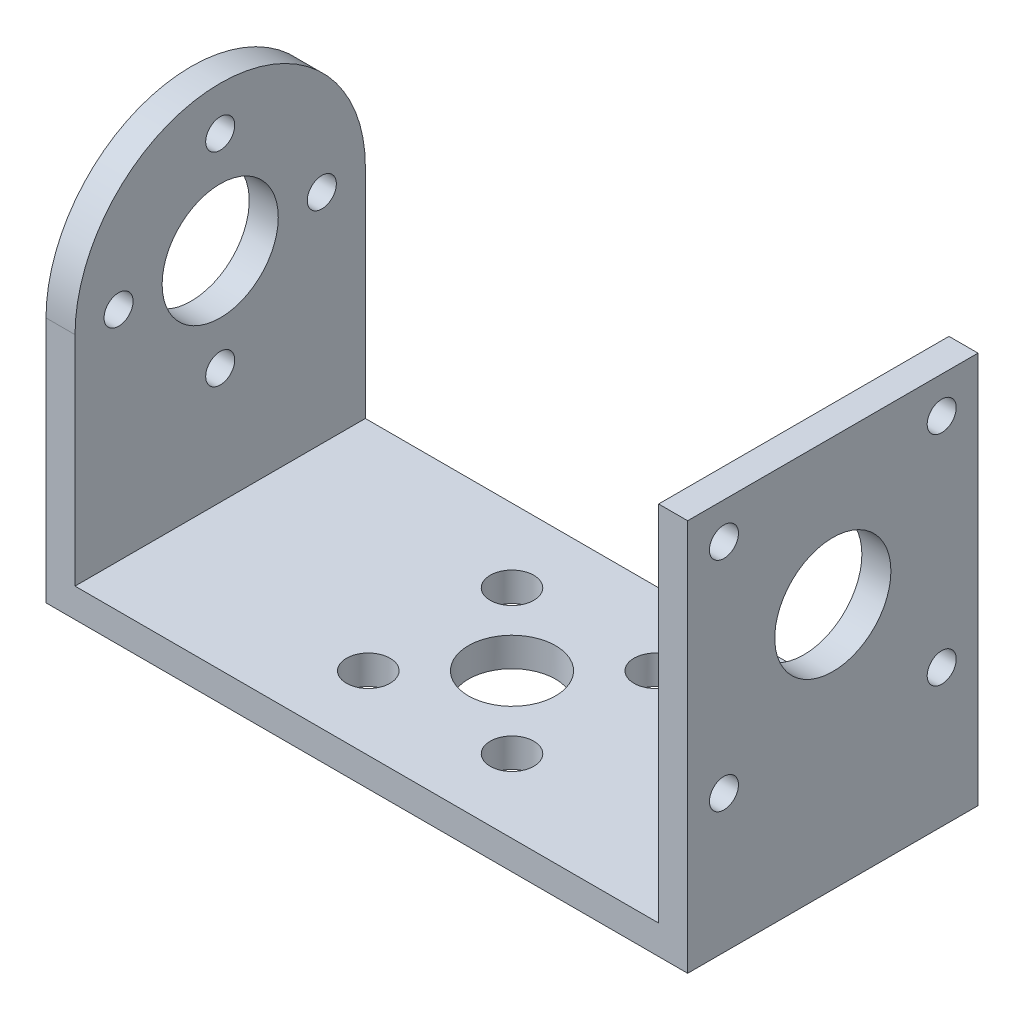
ISO-10303-21;
HEADER;
FILE_DESCRIPTION(('STEP AP214'),'2;1');
FILE_NAME('part.step','',(''),(''),'','','');
FILE_SCHEMA(('AUTOMOTIVE_DESIGN { 1 0 10303 214 1 1 1 1 }'));
ENDSEC;
DATA;
#1=APPLICATION_CONTEXT('core data for automotive mechanical design processes');
#2=APPLICATION_PROTOCOL_DEFINITION('international standard','automotive_design',2000,#1);
#3=PRODUCT_CONTEXT('',#1,'mechanical');
#4=PRODUCT('Part','Part','',(#3));
#5=PRODUCT_RELATED_PRODUCT_CATEGORY('part','',(#4));
#6=PRODUCT_DEFINITION_FORMATION('','',#4);
#7=PRODUCT_DEFINITION_CONTEXT('part definition',#1,'design');
#8=PRODUCT_DEFINITION('design','',#6,#7);
#9=PRODUCT_DEFINITION_SHAPE('','',#8);
#10=(LENGTH_UNIT() NAMED_UNIT(*) SI_UNIT(.MILLI.,.METRE.));
#11=(NAMED_UNIT(*) PLANE_ANGLE_UNIT() SI_UNIT($,.RADIAN.));
#12=(NAMED_UNIT(*) SI_UNIT($,.STERADIAN.) SOLID_ANGLE_UNIT());
#13=UNCERTAINTY_MEASURE_WITH_UNIT(LENGTH_MEASURE(1.E-05),#10,'distance_accuracy_value','');
#14=(GEOMETRIC_REPRESENTATION_CONTEXT(3) GLOBAL_UNCERTAINTY_ASSIGNED_CONTEXT((#13)) GLOBAL_UNIT_ASSIGNED_CONTEXT((#10,
#11,#12)) REPRESENTATION_CONTEXT('',''));
#15=CARTESIAN_POINT('',(0.,0.,0.));
#16=DIRECTION('',(0.,0.,1.));
#17=DIRECTION('',(1.,0.,0.));
#18=AXIS2_PLACEMENT_3D('',#15,#16,#17);
#19=CARTESIAN_POINT('',(-22.1,2.,10.));
#20=DIRECTION('',(1.,0.,0.));
#21=DIRECTION('',(0.,0.,-1.));
#22=AXIS2_PLACEMENT_3D('',#19,#20,#21);
#23=PLANE('',#22);
#24=CARTESIAN_POINT('',(-22.1,17.,0.));
#25=DIRECTION('',(-1.,0.,0.));
#26=DIRECTION('',(0.,0.,1.));
#27=AXIS2_PLACEMENT_3D('',#24,#25,#26);
#28=CIRCLE('',#27,4.);
#29=CARTESIAN_POINT('',(-22.1,17.,4.));
#30=VERTEX_POINT('',#29);
#31=EDGE_CURVE('E289',#30,#30,#28,.T.);
#32=ORIENTED_EDGE('',*,*,#31,.F.);
#33=EDGE_LOOP('',(#32));
#34=FACE_BOUND('',#33,.T.);
#35=CARTESIAN_POINT('',(-22.1,10.,3.46818829043387E-13));
#36=DIRECTION('',(-1.,0.,0.));
#37=DIRECTION('',(0.,0.,1.));
#38=AXIS2_PLACEMENT_3D('',#35,#36,#37);
#39=CIRCLE('',#38,1.);
#40=CARTESIAN_POINT('',(-22.1,10.,1.00000000000035));
#41=VERTEX_POINT('',#40);
#42=EDGE_CURVE('E188',#41,#41,#39,.T.);
#43=ORIENTED_EDGE('',*,*,#42,.F.);
#44=EDGE_LOOP('',(#43));
#45=FACE_BOUND('',#44,.T.);
#46=CARTESIAN_POINT('',(-22.1,16.9999999999999,-6.9999999999998));
#47=DIRECTION('',(-1.,0.,0.));
#48=DIRECTION('',(0.,0.,1.));
#49=AXIS2_PLACEMENT_3D('',#46,#47,#48);
#50=CIRCLE('',#49,0.999999999999999);
#51=CARTESIAN_POINT('',(-22.1,16.9999999999999,-5.9999999999998));
#52=VERTEX_POINT('',#51);
#53=EDGE_CURVE('E266',#52,#52,#50,.T.);
#54=ORIENTED_EDGE('',*,*,#53,.F.);
#55=EDGE_LOOP('',(#54));
#56=FACE_BOUND('',#55,.T.);
#57=CARTESIAN_POINT('',(-22.1,24.,0.));
#58=DIRECTION('',(-1.,0.,0.));
#59=DIRECTION('',(0.,0.,1.));
#60=AXIS2_PLACEMENT_3D('',#57,#58,#59);
#61=CIRCLE('',#60,1.);
#62=CARTESIAN_POINT('',(-22.1,24.,1.));
#63=VERTEX_POINT('',#62);
#64=EDGE_CURVE('E273',#63,#63,#61,.T.);
#65=ORIENTED_EDGE('',*,*,#64,.F.);
#66=EDGE_LOOP('',(#65));
#67=FACE_BOUND('',#66,.T.);
#68=CARTESIAN_POINT('',(-22.1,17.0000000000002,7.0000000000002));
#69=DIRECTION('',(-1.,0.,0.));
#70=DIRECTION('',(0.,0.,1.));
#71=AXIS2_PLACEMENT_3D('',#68,#69,#70);
#72=CIRCLE('',#71,1.);
#73=CARTESIAN_POINT('',(-22.1,17.0000000000002,8.0000000000002));
#74=VERTEX_POINT('',#73);
#75=EDGE_CURVE('E279',#74,#74,#72,.T.);
#76=ORIENTED_EDGE('',*,*,#75,.F.);
#77=EDGE_LOOP('',(#76));
#78=FACE_BOUND('',#77,.T.);
#79=CARTESIAN_POINT('',(-22.1,17.,0.));
#80=DIRECTION('',(-1.,0.,0.));
#81=DIRECTION('',(0.,0.,1.));
#82=AXIS2_PLACEMENT_3D('',#79,#80,#81);
#83=CIRCLE('',#82,10.);
#84=CARTESIAN_POINT('',(-22.1,17.,10.));
#85=VERTEX_POINT('',#84);
#86=CARTESIAN_POINT('',(-22.1,17.,-10.));
#87=VERTEX_POINT('',#86);
#88=EDGE_CURVE('E174',#85,#87,#83,.T.);
#89=ORIENTED_EDGE('',*,*,#88,.T.);
#90=DIRECTION('',(0.,-1.,0.));
#91=VECTOR('',#90,1.);
#92=CARTESIAN_POINT('',(-22.1,2.,-10.));
#93=LINE('',#92,#91);
#94=CARTESIAN_POINT('',(-22.1,0.,-10.));
#95=VERTEX_POINT('',#94);
#96=EDGE_CURVE('E117',#87,#95,#93,.T.);
#97=ORIENTED_EDGE('',*,*,#96,.T.);
#98=DIRECTION('',(0.,0.,1.));
#99=VECTOR('',#98,1.);
#100=CARTESIAN_POINT('',(-22.1,0.,10.));
#101=LINE('',#100,#99);
#102=CARTESIAN_POINT('',(-22.1,0.,10.));
#103=VERTEX_POINT('',#102);
#104=EDGE_CURVE('E201',#95,#103,#101,.T.);
#105=ORIENTED_EDGE('',*,*,#104,.T.);
#106=DIRECTION('',(0.,-1.,0.));
#107=VECTOR('',#106,1.);
#108=CARTESIAN_POINT('',(-22.1,2.,10.));
#109=LINE('',#108,#107);
#110=EDGE_CURVE('E179',#85,#103,#109,.T.);
#111=ORIENTED_EDGE('',*,*,#110,.F.);
#112=EDGE_LOOP('',(#89,#97,#105,#111));
#113=FACE_BOUND('',#112,.T.);
#114=ADVANCED_FACE('F109',(#34,#45,#56,#67,#78,#113),#23,.F.);
#115=CARTESIAN_POINT('',(-20.1,0.,0.));
#116=DIRECTION('',(1.,0.,0.));
#117=DIRECTION('',(0.,0.,-1.));
#118=AXIS2_PLACEMENT_3D('',#115,#116,#117);
#119=PLANE('',#118);
#120=CARTESIAN_POINT('',(-20.1,17.,0.));
#121=DIRECTION('',(1.,0.,0.));
#122=DIRECTION('',(0.,0.,-1.));
#123=AXIS2_PLACEMENT_3D('',#120,#121,#122);
#124=CIRCLE('',#123,4.);
#125=CARTESIAN_POINT('',(-20.1,17.,-4.));
#126=VERTEX_POINT('',#125);
#127=EDGE_CURVE('E292',#126,#126,#124,.F.);
#128=ORIENTED_EDGE('',*,*,#127,.T.);
#129=EDGE_LOOP('',(#128));
#130=FACE_BOUND('',#129,.T.);
#131=CARTESIAN_POINT('',(-20.1,10.,3.46818829043387E-13));
#132=DIRECTION('',(1.,0.,0.));
#133=DIRECTION('',(0.,0.,-1.));
#134=AXIS2_PLACEMENT_3D('',#131,#132,#133);
#135=CIRCLE('',#134,1.);
#136=CARTESIAN_POINT('',(-20.1,10.,-0.999999999999654));
#137=VERTEX_POINT('',#136);
#138=EDGE_CURVE('E286',#137,#137,#135,.F.);
#139=ORIENTED_EDGE('',*,*,#138,.T.);
#140=EDGE_LOOP('',(#139));
#141=FACE_BOUND('',#140,.T.);
#142=CARTESIAN_POINT('',(-20.1,17.0000000000002,7.0000000000002));
#143=DIRECTION('',(1.,0.,0.));
#144=DIRECTION('',(0.,0.,-1.));
#145=AXIS2_PLACEMENT_3D('',#142,#143,#144);
#146=CIRCLE('',#145,1.);
#147=CARTESIAN_POINT('',(-20.1,17.0000000000002,6.0000000000002));
#148=VERTEX_POINT('',#147);
#149=EDGE_CURVE('E187',#148,#148,#146,.F.);
#150=ORIENTED_EDGE('',*,*,#149,.T.);
#151=EDGE_LOOP('',(#150));
#152=FACE_BOUND('',#151,.T.);
#153=CARTESIAN_POINT('',(-20.1,24.,0.));
#154=DIRECTION('',(1.,0.,0.));
#155=DIRECTION('',(0.,0.,-1.));
#156=AXIS2_PLACEMENT_3D('',#153,#154,#155);
#157=CIRCLE('',#156,1.);
#158=CARTESIAN_POINT('',(-20.1,24.,-1.));
#159=VERTEX_POINT('',#158);
#160=EDGE_CURVE('E276',#159,#159,#157,.F.);
#161=ORIENTED_EDGE('',*,*,#160,.T.);
#162=EDGE_LOOP('',(#161));
#163=FACE_BOUND('',#162,.T.);
#164=CARTESIAN_POINT('',(-20.1,16.9999999999999,-6.9999999999998));
#165=DIRECTION('',(1.,0.,0.));
#166=DIRECTION('',(0.,0.,-1.));
#167=AXIS2_PLACEMENT_3D('',#164,#165,#166);
#168=CIRCLE('',#167,0.999999999999999);
#169=CARTESIAN_POINT('',(-20.1,16.9999999999999,-7.9999999999998));
#170=VERTEX_POINT('',#169);
#171=EDGE_CURVE('E270',#170,#170,#168,.F.);
#172=ORIENTED_EDGE('',*,*,#171,.T.);
#173=EDGE_LOOP('',(#172));
#174=FACE_BOUND('',#173,.T.);
#175=DIRECTION('',(0.,-1.,0.));
#176=VECTOR('',#175,1.);
#177=CARTESIAN_POINT('',(-20.1,2.,-10.));
#178=LINE('',#177,#176);
#179=CARTESIAN_POINT('',(-20.1,17.,-10.));
#180=VERTEX_POINT('',#179);
#181=CARTESIAN_POINT('',(-20.1,2.,-10.));
#182=VERTEX_POINT('',#181);
#183=EDGE_CURVE('E245',#180,#182,#178,.T.);
#184=ORIENTED_EDGE('',*,*,#183,.F.);
#185=CARTESIAN_POINT('',(-20.1,17.,0.));
#186=DIRECTION('',(1.,0.,0.));
#187=DIRECTION('',(0.,0.,-1.));
#188=AXIS2_PLACEMENT_3D('',#185,#186,#187);
#189=CIRCLE('',#188,10.);
#190=CARTESIAN_POINT('',(-20.1,17.,10.));
#191=VERTEX_POINT('',#190);
#192=EDGE_CURVE('E180',#191,#180,#189,.F.);
#193=ORIENTED_EDGE('',*,*,#192,.F.);
#194=DIRECTION('',(0.,1.,0.));
#195=VECTOR('',#194,1.);
#196=CARTESIAN_POINT('',(-20.1,2.,10.));
#197=LINE('',#196,#195);
#198=CARTESIAN_POINT('',(-20.1,2.,10.));
#199=VERTEX_POINT('',#198);
#200=EDGE_CURVE('E221',#199,#191,#197,.T.);
#201=ORIENTED_EDGE('',*,*,#200,.F.);
#202=DIRECTION('',(0.,0.,1.));
#203=VECTOR('',#202,1.);
#204=CARTESIAN_POINT('',(-20.1,2.,-10.));
#205=LINE('',#204,#203);
#206=EDGE_CURVE('E243',#182,#199,#205,.T.);
#207=ORIENTED_EDGE('',*,*,#206,.F.);
#208=EDGE_LOOP('',(#184,#193,#201,#207));
#209=FACE_BOUND('',#208,.T.);
#210=ADVANCED_FACE('F363',(#130,#141,#152,#163,#174,#209),#119,.T.);
#211=CARTESIAN_POINT('',(-22.1,2.,-10.));
#212=DIRECTION('',(0.,0.,1.));
#213=DIRECTION('',(1.,0.,0.));
#214=AXIS2_PLACEMENT_3D('',#211,#212,#213);
#215=PLANE('',#214);
#216=DIRECTION('',(-1.,0.,0.));
#217=VECTOR('',#216,1.);
#218=CARTESIAN_POINT('',(22.101,17.,-10.));
#219=LINE('',#218,#217);
#220=EDGE_CURVE('E183',#180,#87,#219,.T.);
#221=ORIENTED_EDGE('',*,*,#220,.F.);
#222=ORIENTED_EDGE('',*,*,#183,.T.);
#223=DIRECTION('',(-1.,0.,0.));
#224=VECTOR('',#223,1.);
#225=CARTESIAN_POINT('',(-22.1,2.,-10.));
#226=LINE('',#225,#224);
#227=CARTESIAN_POINT('',(20.1,2.,-10.));
#228=VERTEX_POINT('',#227);
#229=EDGE_CURVE('E200',#228,#182,#226,.T.);
#230=ORIENTED_EDGE('',*,*,#229,.F.);
#231=DIRECTION('',(0.,-1.,0.));
#232=VECTOR('',#231,1.);
#233=CARTESIAN_POINT('',(20.1,2.,-10.));
#234=LINE('',#233,#232);
#235=CARTESIAN_POINT('',(20.1,27.,-10.));
#236=VERTEX_POINT('',#235);
#237=EDGE_CURVE('E257',#236,#228,#234,.T.);
#238=ORIENTED_EDGE('',*,*,#237,.F.);
#239=DIRECTION('',(1.,0.,0.));
#240=VECTOR('',#239,1.);
#241=CARTESIAN_POINT('',(20.1,27.,-10.));
#242=LINE('',#241,#240);
#243=CARTESIAN_POINT('',(22.1,27.,-10.));
#244=VERTEX_POINT('',#243);
#245=EDGE_CURVE('E248',#236,#244,#242,.T.);
#246=ORIENTED_EDGE('',*,*,#245,.T.);
#247=DIRECTION('',(0.,-1.,0.));
#248=VECTOR('',#247,1.);
#249=CARTESIAN_POINT('',(22.1,2.,-10.));
#250=LINE('',#249,#248);
#251=CARTESIAN_POINT('',(22.1,0.,-10.));
#252=VERTEX_POINT('',#251);
#253=EDGE_CURVE('E12',#244,#252,#250,.T.);
#254=ORIENTED_EDGE('',*,*,#253,.T.);
#255=DIRECTION('',(-1.,0.,0.));
#256=VECTOR('',#255,1.);
#257=CARTESIAN_POINT('',(-22.1,0.,-10.));
#258=LINE('',#257,#256);
#259=EDGE_CURVE('E191',#252,#95,#258,.T.);
#260=ORIENTED_EDGE('',*,*,#259,.T.);
#261=ORIENTED_EDGE('',*,*,#96,.F.);
#262=EDGE_LOOP('',(#221,#222,#230,#238,#246,#254,#260,#261));
#263=FACE_BOUND('',#262,.T.);
#264=ADVANCED_FACE('F190',(#263),#215,.F.);
#265=CARTESIAN_POINT('',(22.1,2.,10.));
#266=DIRECTION('',(-1.,0.,0.));
#267=DIRECTION('',(0.,0.,1.));
#268=AXIS2_PLACEMENT_3D('',#265,#266,#267);
#269=PLANE('',#268);
#270=CARTESIAN_POINT('',(22.1,24.5,7.5));
#271=DIRECTION('',(1.,0.,0.));
#272=DIRECTION('',(0.,0.,-1.));
#273=AXIS2_PLACEMENT_3D('',#270,#271,#272);
#274=CIRCLE('',#273,1.);
#275=CARTESIAN_POINT('',(22.1,24.5,6.5));
#276=VERTEX_POINT('',#275);
#277=EDGE_CURVE('E299',#276,#276,#274,.T.);
#278=ORIENTED_EDGE('',*,*,#277,.F.);
#279=EDGE_LOOP('',(#278));
#280=FACE_BOUND('',#279,.T.);
#281=CARTESIAN_POINT('',(22.1,24.5,-7.5));
#282=DIRECTION('',(1.,0.,0.));
#283=DIRECTION('',(0.,0.,-1.));
#284=AXIS2_PLACEMENT_3D('',#281,#282,#283);
#285=CIRCLE('',#284,1.);
#286=CARTESIAN_POINT('',(22.1,24.5,-8.5));
#287=VERTEX_POINT('',#286);
#288=EDGE_CURVE('E315',#287,#287,#285,.T.);
#289=ORIENTED_EDGE('',*,*,#288,.F.);
#290=EDGE_LOOP('',(#289));
#291=FACE_BOUND('',#290,.T.);
#292=CARTESIAN_POINT('',(22.1,9.5,-7.50000000000016));
#293=DIRECTION('',(1.,0.,0.));
#294=DIRECTION('',(0.,0.,-1.));
#295=AXIS2_PLACEMENT_3D('',#292,#293,#294);
#296=CIRCLE('',#295,1.);
#297=CARTESIAN_POINT('',(22.1,9.5,-8.50000000000016));
#298=VERTEX_POINT('',#297);
#299=EDGE_CURVE('E311',#298,#298,#296,.T.);
#300=ORIENTED_EDGE('',*,*,#299,.F.);
#301=EDGE_LOOP('',(#300));
#302=FACE_BOUND('',#301,.T.);
#303=CARTESIAN_POINT('',(22.1,9.5,7.49999999999984));
#304=DIRECTION('',(1.,0.,0.));
#305=DIRECTION('',(0.,0.,-1.));
#306=AXIS2_PLACEMENT_3D('',#303,#304,#305);
#307=CIRCLE('',#306,1.);
#308=CARTESIAN_POINT('',(22.1,9.5,6.49999999999984));
#309=VERTEX_POINT('',#308);
#310=EDGE_CURVE('E305',#309,#309,#307,.T.);
#311=ORIENTED_EDGE('',*,*,#310,.F.);
#312=EDGE_LOOP('',(#311));
#313=FACE_BOUND('',#312,.T.);
#314=CARTESIAN_POINT('',(22.1,17.,0.));
#315=DIRECTION('',(1.,0.,0.));
#316=DIRECTION('',(0.,0.,-1.));
#317=AXIS2_PLACEMENT_3D('',#314,#315,#316);
#318=CIRCLE('',#317,4.);
#319=CARTESIAN_POINT('',(22.1,17.,-4.));
#320=VERTEX_POINT('',#319);
#321=EDGE_CURVE('E295',#320,#320,#318,.T.);
#322=ORIENTED_EDGE('',*,*,#321,.F.);
#323=EDGE_LOOP('',(#322));
#324=FACE_BOUND('',#323,.T.);
#325=DIRECTION('',(0.,0.,-1.));
#326=VECTOR('',#325,1.);
#327=CARTESIAN_POINT('',(22.1,0.,10.));
#328=LINE('',#327,#326);
#329=CARTESIAN_POINT('',(22.1,0.,10.));
#330=VERTEX_POINT('',#329);
#331=EDGE_CURVE('E204',#330,#252,#328,.T.);
#332=ORIENTED_EDGE('',*,*,#331,.T.);
#333=ORIENTED_EDGE('',*,*,#253,.F.);
#334=DIRECTION('',(0.,0.,-1.));
#335=VECTOR('',#334,1.);
#336=CARTESIAN_POINT('',(22.1,27.,-10.));
#337=LINE('',#336,#335);
#338=CARTESIAN_POINT('',(22.1,27.,10.));
#339=VERTEX_POINT('',#338);
#340=EDGE_CURVE('E254',#339,#244,#337,.T.);
#341=ORIENTED_EDGE('',*,*,#340,.F.);
#342=DIRECTION('',(0.,-1.,0.));
#343=VECTOR('',#342,1.);
#344=CARTESIAN_POINT('',(22.1,2.,10.));
#345=LINE('',#344,#343);
#346=EDGE_CURVE('E193',#339,#330,#345,.T.);
#347=ORIENTED_EDGE('',*,*,#346,.T.);
#348=EDGE_LOOP('',(#332,#333,#341,#347));
#349=FACE_BOUND('',#348,.T.);
#350=ADVANCED_FACE('F111',(#280,#291,#302,#313,#324,#349),#269,.F.);
#351=CARTESIAN_POINT('',(-22.1,2.,10.));
#352=DIRECTION('',(0.,0.,-1.));
#353=DIRECTION('',(-1.,0.,0.));
#354=AXIS2_PLACEMENT_3D('',#351,#352,#353);
#355=PLANE('',#354);
#356=ORIENTED_EDGE('',*,*,#200,.T.);
#357=DIRECTION('',(-1.,0.,0.));
#358=VECTOR('',#357,1.);
#359=CARTESIAN_POINT('',(22.101,17.,10.));
#360=LINE('',#359,#358);
#361=EDGE_CURVE('E124',#191,#85,#360,.T.);
#362=ORIENTED_EDGE('',*,*,#361,.T.);
#363=ORIENTED_EDGE('',*,*,#110,.T.);
#364=DIRECTION('',(1.,0.,0.));
#365=VECTOR('',#364,1.);
#366=CARTESIAN_POINT('',(-22.1,0.,10.));
#367=LINE('',#366,#365);
#368=EDGE_CURVE('E198',#103,#330,#367,.T.);
#369=ORIENTED_EDGE('',*,*,#368,.T.);
#370=ORIENTED_EDGE('',*,*,#346,.F.);
#371=DIRECTION('',(1.,0.,0.));
#372=VECTOR('',#371,1.);
#373=CARTESIAN_POINT('',(20.1,27.,10.));
#374=LINE('',#373,#372);
#375=CARTESIAN_POINT('',(20.1,27.,10.));
#376=VERTEX_POINT('',#375);
#377=EDGE_CURVE('E247',#376,#339,#374,.T.);
#378=ORIENTED_EDGE('',*,*,#377,.F.);
#379=DIRECTION('',(0.,1.,0.));
#380=VECTOR('',#379,1.);
#381=CARTESIAN_POINT('',(20.1,2.,10.));
#382=LINE('',#381,#380);
#383=CARTESIAN_POINT('',(20.1,2.,10.));
#384=VERTEX_POINT('',#383);
#385=EDGE_CURVE('E259',#384,#376,#382,.T.);
#386=ORIENTED_EDGE('',*,*,#385,.F.);
#387=DIRECTION('',(1.,0.,0.));
#388=VECTOR('',#387,1.);
#389=CARTESIAN_POINT('',(-22.1,2.,10.));
#390=LINE('',#389,#388);
#391=EDGE_CURVE('E132',#199,#384,#390,.T.);
#392=ORIENTED_EDGE('',*,*,#391,.F.);
#393=EDGE_LOOP('',(#356,#362,#363,#369,#370,#378,#386,#392));
#394=FACE_BOUND('',#393,.T.);
#395=ADVANCED_FACE('F338',(#394),#355,.F.);
#396=CARTESIAN_POINT('',(0.,2.,0.));
#397=DIRECTION('',(0.,-1.,0.));
#398=DIRECTION('',(0.,0.,-1.));
#399=AXIS2_PLACEMENT_3D('',#396,#397,#398);
#400=PLANE('',#399);
#401=CARTESIAN_POINT('',(4.94974746830581,2.,4.94974746830581));
#402=DIRECTION('',(0.,1.,0.));
#403=DIRECTION('',(0.,0.,1.));
#404=AXIS2_PLACEMENT_3D('',#401,#402,#403);
#405=CIRCLE('',#404,1.5000000000001);
#406=CARTESIAN_POINT('',(4.94974746830581,2.,6.44974746830591));
#407=VERTEX_POINT('',#406);
#408=EDGE_CURVE('E214',#407,#407,#405,.T.);
#409=ORIENTED_EDGE('',*,*,#408,.F.);
#410=EDGE_LOOP('',(#409));
#411=FACE_BOUND('',#410,.T.);
#412=CARTESIAN_POINT('',(-4.94974746830586,2.,4.94974746830581));
#413=DIRECTION('',(0.,1.,0.));
#414=DIRECTION('',(0.,0.,1.));
#415=AXIS2_PLACEMENT_3D('',#412,#413,#414);
#416=CIRCLE('',#415,1.50000000000009);
#417=CARTESIAN_POINT('',(-4.94974746830586,2.,6.4497474683059));
#418=VERTEX_POINT('',#417);
#419=EDGE_CURVE('E233',#418,#418,#416,.T.);
#420=ORIENTED_EDGE('',*,*,#419,.F.);
#421=EDGE_LOOP('',(#420));
#422=FACE_BOUND('',#421,.T.);
#423=CARTESIAN_POINT('',(-4.94974746830586,2.,-4.94974746830585));
#424=DIRECTION('',(0.,1.,0.));
#425=DIRECTION('',(0.,0.,1.));
#426=AXIS2_PLACEMENT_3D('',#423,#424,#425);
#427=CIRCLE('',#426,1.50000000000002);
#428=CARTESIAN_POINT('',(-4.94974746830586,2.,-3.44974746830583));
#429=VERTEX_POINT('',#428);
#430=EDGE_CURVE('E227',#429,#429,#427,.T.);
#431=ORIENTED_EDGE('',*,*,#430,.F.);
#432=EDGE_LOOP('',(#431));
#433=FACE_BOUND('',#432,.T.);
#434=CARTESIAN_POINT('',(4.94974746830583,2.,-4.94974746830585));
#435=DIRECTION('',(0.,1.,0.));
#436=DIRECTION('',(0.,0.,1.));
#437=AXIS2_PLACEMENT_3D('',#434,#435,#436);
#438=CIRCLE('',#437,1.5);
#439=CARTESIAN_POINT('',(4.94974746830583,2.,-3.44974746830585));
#440=VERTEX_POINT('',#439);
#441=EDGE_CURVE('E220',#440,#440,#438,.T.);
#442=ORIENTED_EDGE('',*,*,#441,.F.);
#443=EDGE_LOOP('',(#442));
#444=FACE_BOUND('',#443,.T.);
#445=CARTESIAN_POINT('',(0.,2.,0.));
#446=DIRECTION('',(0.,1.,0.));
#447=DIRECTION('',(0.,0.,1.));
#448=AXIS2_PLACEMENT_3D('',#445,#446,#447);
#449=CIRCLE('',#448,3.);
#450=CARTESIAN_POINT('',(0.,2.,3.));
#451=VERTEX_POINT('',#450);
#452=EDGE_CURVE('E207',#451,#451,#449,.T.);
#453=ORIENTED_EDGE('',*,*,#452,.F.);
#454=EDGE_LOOP('',(#453));
#455=FACE_BOUND('',#454,.T.);
#456=ORIENTED_EDGE('',*,*,#391,.T.);
#457=DIRECTION('',(0.,0.,1.));
#458=VECTOR('',#457,1.);
#459=CARTESIAN_POINT('',(20.1,2.,-10.));
#460=LINE('',#459,#458);
#461=EDGE_CURVE('E251',#228,#384,#460,.T.);
#462=ORIENTED_EDGE('',*,*,#461,.F.);
#463=ORIENTED_EDGE('',*,*,#229,.T.);
#464=ORIENTED_EDGE('',*,*,#206,.T.);
#465=EDGE_LOOP('',(#456,#462,#463,#464));
#466=FACE_BOUND('',#465,.T.);
#467=ADVANCED_FACE('F364',(#411,#422,#433,#444,#455,#466),#400,.F.);
#468=CARTESIAN_POINT('',(0.,0.,0.));
#469=DIRECTION('',(0.,-1.,0.));
#470=DIRECTION('',(0.,0.,-1.));
#471=AXIS2_PLACEMENT_3D('',#468,#469,#470);
#472=PLANE('',#471);
#473=CARTESIAN_POINT('',(4.94974746830581,0.,4.94974746830581));
#474=DIRECTION('',(0.,-1.,0.));
#475=DIRECTION('',(0.,0.,-1.));
#476=AXIS2_PLACEMENT_3D('',#473,#474,#475);
#477=CIRCLE('',#476,1.5000000000001);
#478=CARTESIAN_POINT('',(4.94974746830581,0.,3.44974746830571));
#479=VERTEX_POINT('',#478);
#480=EDGE_CURVE('E236',#479,#479,#477,.F.);
#481=ORIENTED_EDGE('',*,*,#480,.T.);
#482=EDGE_LOOP('',(#481));
#483=FACE_BOUND('',#482,.T.);
#484=CARTESIAN_POINT('',(-4.94974746830586,0.,4.94974746830581));
#485=DIRECTION('',(0.,-1.,0.));
#486=DIRECTION('',(0.,0.,-1.));
#487=AXIS2_PLACEMENT_3D('',#484,#485,#486);
#488=CIRCLE('',#487,1.50000000000009);
#489=CARTESIAN_POINT('',(-4.94974746830586,0.,3.44974746830573));
#490=VERTEX_POINT('',#489);
#491=EDGE_CURVE('E230',#490,#490,#488,.F.);
#492=ORIENTED_EDGE('',*,*,#491,.T.);
#493=EDGE_LOOP('',(#492));
#494=FACE_BOUND('',#493,.T.);
#495=CARTESIAN_POINT('',(-4.94974746830586,0.,-4.94974746830585));
#496=DIRECTION('',(0.,-1.,0.));
#497=DIRECTION('',(0.,0.,-1.));
#498=AXIS2_PLACEMENT_3D('',#495,#496,#497);
#499=CIRCLE('',#498,1.50000000000002);
#500=CARTESIAN_POINT('',(-4.94974746830586,0.,-6.44974746830587));
#501=VERTEX_POINT('',#500);
#502=EDGE_CURVE('E224',#501,#501,#499,.F.);
#503=ORIENTED_EDGE('',*,*,#502,.T.);
#504=EDGE_LOOP('',(#503));
#505=FACE_BOUND('',#504,.T.);
#506=CARTESIAN_POINT('',(4.94974746830583,0.,-4.94974746830585));
#507=DIRECTION('',(0.,-1.,0.));
#508=DIRECTION('',(0.,0.,-1.));
#509=AXIS2_PLACEMENT_3D('',#506,#507,#508);
#510=CIRCLE('',#509,1.5);
#511=CARTESIAN_POINT('',(4.94974746830583,0.,-6.44974746830585));
#512=VERTEX_POINT('',#511);
#513=EDGE_CURVE('E217',#512,#512,#510,.F.);
#514=ORIENTED_EDGE('',*,*,#513,.T.);
#515=EDGE_LOOP('',(#514));
#516=FACE_BOUND('',#515,.T.);
#517=CARTESIAN_POINT('',(0.,0.,0.));
#518=DIRECTION('',(0.,-1.,0.));
#519=DIRECTION('',(0.,0.,-1.));
#520=AXIS2_PLACEMENT_3D('',#517,#518,#519);
#521=CIRCLE('',#520,3.);
#522=CARTESIAN_POINT('',(0.,0.,-3.));
#523=VERTEX_POINT('',#522);
#524=EDGE_CURVE('E211',#523,#523,#521,.F.);
#525=ORIENTED_EDGE('',*,*,#524,.T.);
#526=EDGE_LOOP('',(#525));
#527=FACE_BOUND('',#526,.T.);
#528=ORIENTED_EDGE('',*,*,#331,.F.);
#529=ORIENTED_EDGE('',*,*,#368,.F.);
#530=ORIENTED_EDGE('',*,*,#104,.F.);
#531=ORIENTED_EDGE('',*,*,#259,.F.);
#532=EDGE_LOOP('',(#528,#529,#530,#531));
#533=FACE_BOUND('',#532,.T.);
#534=ADVANCED_FACE('F351',(#483,#494,#505,#516,#527,#533),#472,.T.);
#535=CARTESIAN_POINT('',(0.,-0.00100000000000013,0.));
#536=DIRECTION('',(0.,1.,0.));
#537=DIRECTION('',(0.,0.,1.));
#538=AXIS2_PLACEMENT_3D('',#535,#536,#537);
#539=CYLINDRICAL_SURFACE('',#538,3.);
#540=ORIENTED_EDGE('',*,*,#524,.F.);
#541=EDGE_LOOP('',(#540));
#542=FACE_BOUND('',#541,.T.);
#543=ORIENTED_EDGE('',*,*,#452,.T.);
#544=EDGE_LOOP('',(#543));
#545=FACE_BOUND('',#544,.T.);
#546=ADVANCED_FACE('F419',(#542,#545),#539,.F.);
#547=CARTESIAN_POINT('',(4.94974746830583,-0.00100000000000013,-4.94974746830585));
#548=DIRECTION('',(0.,1.,0.));
#549=DIRECTION('',(0.,0.,1.));
#550=AXIS2_PLACEMENT_3D('',#547,#548,#549);
#551=CYLINDRICAL_SURFACE('',#550,1.5);
#552=ORIENTED_EDGE('',*,*,#513,.F.);
#553=EDGE_LOOP('',(#552));
#554=FACE_BOUND('',#553,.T.);
#555=ORIENTED_EDGE('',*,*,#441,.T.);
#556=EDGE_LOOP('',(#555));
#557=FACE_BOUND('',#556,.T.);
#558=ADVANCED_FACE('F426',(#554,#557),#551,.F.);
#559=CARTESIAN_POINT('',(-4.94974746830586,-0.00100000000000013,-4.94974746830585));
#560=DIRECTION('',(0.,1.,0.));
#561=DIRECTION('',(0.,0.,1.));
#562=AXIS2_PLACEMENT_3D('',#559,#560,#561);
#563=CYLINDRICAL_SURFACE('',#562,1.50000000000002);
#564=ORIENTED_EDGE('',*,*,#502,.F.);
#565=EDGE_LOOP('',(#564));
#566=FACE_BOUND('',#565,.T.);
#567=ORIENTED_EDGE('',*,*,#430,.T.);
#568=EDGE_LOOP('',(#567));
#569=FACE_BOUND('',#568,.T.);
#570=ADVANCED_FACE('F434',(#566,#569),#563,.F.);
#571=CARTESIAN_POINT('',(-4.94974746830586,-0.00100000000000013,4.94974746830581));
#572=DIRECTION('',(0.,1.,0.));
#573=DIRECTION('',(0.,0.,1.));
#574=AXIS2_PLACEMENT_3D('',#571,#572,#573);
#575=CYLINDRICAL_SURFACE('',#574,1.50000000000009);
#576=ORIENTED_EDGE('',*,*,#491,.F.);
#577=EDGE_LOOP('',(#576));
#578=FACE_BOUND('',#577,.T.);
#579=ORIENTED_EDGE('',*,*,#419,.T.);
#580=EDGE_LOOP('',(#579));
#581=FACE_BOUND('',#580,.T.);
#582=ADVANCED_FACE('F442',(#578,#581),#575,.F.);
#583=CARTESIAN_POINT('',(4.94974746830581,-0.00100000000000013,4.94974746830581));
#584=DIRECTION('',(0.,1.,0.));
#585=DIRECTION('',(0.,0.,1.));
#586=AXIS2_PLACEMENT_3D('',#583,#584,#585);
#587=CYLINDRICAL_SURFACE('',#586,1.5000000000001);
#588=ORIENTED_EDGE('',*,*,#480,.F.);
#589=EDGE_LOOP('',(#588));
#590=FACE_BOUND('',#589,.T.);
#591=ORIENTED_EDGE('',*,*,#408,.T.);
#592=EDGE_LOOP('',(#591));
#593=FACE_BOUND('',#592,.T.);
#594=ADVANCED_FACE('F374',(#590,#593),#587,.F.);
#595=CARTESIAN_POINT('',(20.1,27.,-10.));
#596=DIRECTION('',(0.,-1.,0.));
#597=DIRECTION('',(0.,0.,-1.));
#598=AXIS2_PLACEMENT_3D('',#595,#596,#597);
#599=PLANE('',#598);
#600=ORIENTED_EDGE('',*,*,#340,.T.);
#601=ORIENTED_EDGE('',*,*,#245,.F.);
#602=DIRECTION('',(0.,0.,-1.));
#603=VECTOR('',#602,1.);
#604=CARTESIAN_POINT('',(20.1,27.,-10.));
#605=LINE('',#604,#603);
#606=EDGE_CURVE('E261',#376,#236,#605,.T.);
#607=ORIENTED_EDGE('',*,*,#606,.F.);
#608=ORIENTED_EDGE('',*,*,#377,.T.);
#609=EDGE_LOOP('',(#600,#601,#607,#608));
#610=FACE_BOUND('',#609,.T.);
#611=ADVANCED_FACE('F357',(#610),#599,.F.);
#612=CARTESIAN_POINT('',(20.1,0.,0.));
#613=DIRECTION('',(-1.,0.,0.));
#614=DIRECTION('',(0.,0.,-1.));
#615=AXIS2_PLACEMENT_3D('',#612,#613,#614);
#616=PLANE('',#615);
#617=CARTESIAN_POINT('',(20.1,24.5,7.5));
#618=DIRECTION('',(-1.,0.,0.));
#619=DIRECTION('',(0.,0.,1.));
#620=AXIS2_PLACEMENT_3D('',#617,#618,#619);
#621=CIRCLE('',#620,1.);
#622=CARTESIAN_POINT('',(20.1,24.5,8.5));
#623=VERTEX_POINT('',#622);
#624=EDGE_CURVE('E318',#623,#623,#621,.F.);
#625=ORIENTED_EDGE('',*,*,#624,.T.);
#626=EDGE_LOOP('',(#625));
#627=FACE_BOUND('',#626,.T.);
#628=CARTESIAN_POINT('',(20.1,24.5,-7.5));
#629=DIRECTION('',(-1.,0.,0.));
#630=DIRECTION('',(0.,0.,1.));
#631=AXIS2_PLACEMENT_3D('',#628,#629,#630);
#632=CIRCLE('',#631,1.);
#633=CARTESIAN_POINT('',(20.1,24.5,-6.5));
#634=VERTEX_POINT('',#633);
#635=EDGE_CURVE('E314',#634,#634,#632,.F.);
#636=ORIENTED_EDGE('',*,*,#635,.T.);
#637=EDGE_LOOP('',(#636));
#638=FACE_BOUND('',#637,.T.);
#639=CARTESIAN_POINT('',(20.1,9.5,-7.50000000000016));
#640=DIRECTION('',(-1.,0.,0.));
#641=DIRECTION('',(0.,0.,1.));
#642=AXIS2_PLACEMENT_3D('',#639,#640,#641);
#643=CIRCLE('',#642,1.);
#644=CARTESIAN_POINT('',(20.1,9.5,-6.50000000000016));
#645=VERTEX_POINT('',#644);
#646=EDGE_CURVE('E308',#645,#645,#643,.F.);
#647=ORIENTED_EDGE('',*,*,#646,.T.);
#648=EDGE_LOOP('',(#647));
#649=FACE_BOUND('',#648,.T.);
#650=CARTESIAN_POINT('',(20.1,9.5,7.49999999999984));
#651=DIRECTION('',(-1.,0.,0.));
#652=DIRECTION('',(0.,0.,1.));
#653=AXIS2_PLACEMENT_3D('',#650,#651,#652);
#654=CIRCLE('',#653,1.);
#655=CARTESIAN_POINT('',(20.1,9.5,8.49999999999984));
#656=VERTEX_POINT('',#655);
#657=EDGE_CURVE('E302',#656,#656,#654,.F.);
#658=ORIENTED_EDGE('',*,*,#657,.T.);
#659=EDGE_LOOP('',(#658));
#660=FACE_BOUND('',#659,.T.);
#661=CARTESIAN_POINT('',(20.1,17.,0.));
#662=DIRECTION('',(-1.,0.,0.));
#663=DIRECTION('',(0.,0.,1.));
#664=AXIS2_PLACEMENT_3D('',#661,#662,#663);
#665=CIRCLE('',#664,4.);
#666=CARTESIAN_POINT('',(20.1,17.,4.));
#667=VERTEX_POINT('',#666);
#668=EDGE_CURVE('E296',#667,#667,#665,.F.);
#669=ORIENTED_EDGE('',*,*,#668,.T.);
#670=EDGE_LOOP('',(#669));
#671=FACE_BOUND('',#670,.T.);
#672=ORIENTED_EDGE('',*,*,#237,.T.);
#673=ORIENTED_EDGE('',*,*,#461,.T.);
#674=ORIENTED_EDGE('',*,*,#385,.T.);
#675=ORIENTED_EDGE('',*,*,#606,.T.);
#676=EDGE_LOOP('',(#672,#673,#674,#675));
#677=FACE_BOUND('',#676,.T.);
#678=ADVANCED_FACE('F326',(#627,#638,#649,#660,#671,#677),#616,.T.);
#679=CARTESIAN_POINT('',(22.101,17.,0.));
#680=DIRECTION('',(-1.,0.,0.));
#681=DIRECTION('',(0.,0.,1.));
#682=AXIS2_PLACEMENT_3D('',#679,#680,#681);
#683=CYLINDRICAL_SURFACE('',#682,10.);
#684=ORIENTED_EDGE('',*,*,#192,.T.);
#685=ORIENTED_EDGE('',*,*,#220,.T.);
#686=ORIENTED_EDGE('',*,*,#88,.F.);
#687=ORIENTED_EDGE('',*,*,#361,.F.);
#688=EDGE_LOOP('',(#684,#685,#686,#687));
#689=FACE_BOUND('',#688,.T.);
#690=ADVANCED_FACE('F184',(#689),#683,.T.);
#691=CARTESIAN_POINT('',(22.101,16.9999999999999,-6.9999999999998));
#692=DIRECTION('',(-1.,0.,0.));
#693=DIRECTION('',(0.,0.,1.));
#694=AXIS2_PLACEMENT_3D('',#691,#692,#693);
#695=CYLINDRICAL_SURFACE('',#694,0.999999999999999);
#696=ORIENTED_EDGE('',*,*,#171,.F.);
#697=EDGE_LOOP('',(#696));
#698=FACE_BOUND('',#697,.T.);
#699=ORIENTED_EDGE('',*,*,#53,.T.);
#700=EDGE_LOOP('',(#699));
#701=FACE_BOUND('',#700,.T.);
#702=ADVANCED_FACE('F372',(#698,#701),#695,.F.);
#703=CARTESIAN_POINT('',(22.101,24.,0.));
#704=DIRECTION('',(-1.,0.,0.));
#705=DIRECTION('',(0.,0.,1.));
#706=AXIS2_PLACEMENT_3D('',#703,#704,#705);
#707=CYLINDRICAL_SURFACE('',#706,1.);
#708=ORIENTED_EDGE('',*,*,#160,.F.);
#709=EDGE_LOOP('',(#708));
#710=FACE_BOUND('',#709,.T.);
#711=ORIENTED_EDGE('',*,*,#64,.T.);
#712=EDGE_LOOP('',(#711));
#713=FACE_BOUND('',#712,.T.);
#714=ADVANCED_FACE('F548',(#710,#713),#707,.F.);
#715=CARTESIAN_POINT('',(22.101,17.0000000000002,7.0000000000002));
#716=DIRECTION('',(-1.,0.,0.));
#717=DIRECTION('',(0.,0.,1.));
#718=AXIS2_PLACEMENT_3D('',#715,#716,#717);
#719=CYLINDRICAL_SURFACE('',#718,1.);
#720=ORIENTED_EDGE('',*,*,#149,.F.);
#721=EDGE_LOOP('',(#720));
#722=FACE_BOUND('',#721,.T.);
#723=ORIENTED_EDGE('',*,*,#75,.T.);
#724=EDGE_LOOP('',(#723));
#725=FACE_BOUND('',#724,.T.);
#726=ADVANCED_FACE('F544',(#722,#725),#719,.F.);
#727=CARTESIAN_POINT('',(22.101,10.,3.46818829043387E-13));
#728=DIRECTION('',(-1.,0.,0.));
#729=DIRECTION('',(0.,0.,1.));
#730=AXIS2_PLACEMENT_3D('',#727,#728,#729);
#731=CYLINDRICAL_SURFACE('',#730,1.);
#732=ORIENTED_EDGE('',*,*,#138,.F.);
#733=EDGE_LOOP('',(#732));
#734=FACE_BOUND('',#733,.T.);
#735=ORIENTED_EDGE('',*,*,#42,.T.);
#736=EDGE_LOOP('',(#735));
#737=FACE_BOUND('',#736,.T.);
#738=ADVANCED_FACE('F540',(#734,#737),#731,.F.);
#739=CARTESIAN_POINT('',(22.101,17.,0.));
#740=DIRECTION('',(-1.,0.,0.));
#741=DIRECTION('',(0.,0.,1.));
#742=AXIS2_PLACEMENT_3D('',#739,#740,#741);
#743=CYLINDRICAL_SURFACE('',#742,4.);
#744=ORIENTED_EDGE('',*,*,#127,.F.);
#745=EDGE_LOOP('',(#744));
#746=FACE_BOUND('',#745,.T.);
#747=ORIENTED_EDGE('',*,*,#31,.T.);
#748=EDGE_LOOP('',(#747));
#749=FACE_BOUND('',#748,.T.);
#750=ADVANCED_FACE('F495',(#746,#749),#743,.F.);
#751=CARTESIAN_POINT('',(-22.101,17.,0.));
#752=DIRECTION('',(1.,0.,0.));
#753=DIRECTION('',(0.,0.,-1.));
#754=AXIS2_PLACEMENT_3D('',#751,#752,#753);
#755=CYLINDRICAL_SURFACE('',#754,4.);
#756=ORIENTED_EDGE('',*,*,#668,.F.);
#757=EDGE_LOOP('',(#756));
#758=FACE_BOUND('',#757,.T.);
#759=ORIENTED_EDGE('',*,*,#321,.T.);
#760=EDGE_LOOP('',(#759));
#761=FACE_BOUND('',#760,.T.);
#762=ADVANCED_FACE('F489',(#758,#761),#755,.F.);
#763=CARTESIAN_POINT('',(-22.101,9.5,7.49999999999984));
#764=DIRECTION('',(1.,0.,0.));
#765=DIRECTION('',(0.,0.,-1.));
#766=AXIS2_PLACEMENT_3D('',#763,#764,#765);
#767=CYLINDRICAL_SURFACE('',#766,1.);
#768=ORIENTED_EDGE('',*,*,#657,.F.);
#769=EDGE_LOOP('',(#768));
#770=FACE_BOUND('',#769,.T.);
#771=ORIENTED_EDGE('',*,*,#310,.T.);
#772=EDGE_LOOP('',(#771));
#773=FACE_BOUND('',#772,.T.);
#774=ADVANCED_FACE('F494',(#770,#773),#767,.F.);
#775=CARTESIAN_POINT('',(-22.101,9.5,-7.50000000000016));
#776=DIRECTION('',(1.,0.,0.));
#777=DIRECTION('',(0.,0.,-1.));
#778=AXIS2_PLACEMENT_3D('',#775,#776,#777);
#779=CYLINDRICAL_SURFACE('',#778,1.);
#780=ORIENTED_EDGE('',*,*,#646,.F.);
#781=EDGE_LOOP('',(#780));
#782=FACE_BOUND('',#781,.T.);
#783=ORIENTED_EDGE('',*,*,#299,.T.);
#784=EDGE_LOOP('',(#783));
#785=FACE_BOUND('',#784,.T.);
#786=ADVANCED_FACE('F507',(#782,#785),#779,.F.);
#787=CARTESIAN_POINT('',(-22.101,24.5,-7.5));
#788=DIRECTION('',(1.,0.,0.));
#789=DIRECTION('',(0.,0.,-1.));
#790=AXIS2_PLACEMENT_3D('',#787,#788,#789);
#791=CYLINDRICAL_SURFACE('',#790,1.);
#792=ORIENTED_EDGE('',*,*,#635,.F.);
#793=EDGE_LOOP('',(#792));
#794=FACE_BOUND('',#793,.T.);
#795=ORIENTED_EDGE('',*,*,#288,.T.);
#796=EDGE_LOOP('',(#795));
#797=FACE_BOUND('',#796,.T.);
#798=ADVANCED_FACE('F332',(#794,#797),#791,.F.);
#799=CARTESIAN_POINT('',(-22.101,24.5,7.5));
#800=DIRECTION('',(1.,0.,0.));
#801=DIRECTION('',(0.,0.,-1.));
#802=AXIS2_PLACEMENT_3D('',#799,#800,#801);
#803=CYLINDRICAL_SURFACE('',#802,1.);
#804=ORIENTED_EDGE('',*,*,#624,.F.);
#805=EDGE_LOOP('',(#804));
#806=FACE_BOUND('',#805,.T.);
#807=ORIENTED_EDGE('',*,*,#277,.T.);
#808=EDGE_LOOP('',(#807));
#809=FACE_BOUND('',#808,.T.);
#810=ADVANCED_FACE('F329',(#806,#809),#803,.F.);
#811=CLOSED_SHELL('',(#114,#210,#264,#350,#395,#467,#534,#546,#558,#570,#582,#594,#611,#678,
#690,#702,#714,#726,#738,#750,#762,#774,#786,#798,#810));
#812=MANIFOLD_SOLID_BREP('B2',#811);
#813=ADVANCED_BREP_SHAPE_REPRESENTATION('',(#18,#812),#14);
#814=SHAPE_DEFINITION_REPRESENTATION(#9,#813);
ENDSEC;
END-ISO-10303-21;
